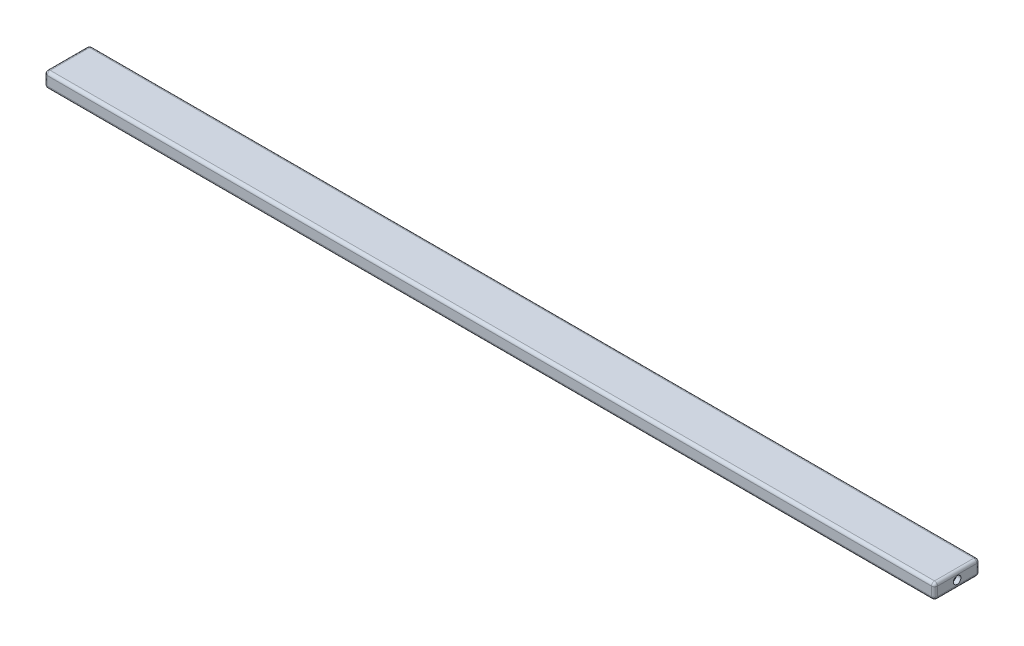
ISO-10303-21;
HEADER;
FILE_DESCRIPTION(('STEP AP214'),'2;1');
FILE_NAME('part.step','',(''),(''),'','','');
FILE_SCHEMA(('AUTOMOTIVE_DESIGN { 1 0 10303 214 1 1 1 1 }'));
ENDSEC;
DATA;
#1=APPLICATION_CONTEXT('core data for automotive mechanical design processes');
#2=APPLICATION_PROTOCOL_DEFINITION('international standard','automotive_design',2000,#1);
#3=PRODUCT_CONTEXT('',#1,'mechanical');
#4=PRODUCT('Part','Part','',(#3));
#5=PRODUCT_RELATED_PRODUCT_CATEGORY('part','',(#4));
#6=PRODUCT_DEFINITION_FORMATION('','',#4);
#7=PRODUCT_DEFINITION_CONTEXT('part definition',#1,'design');
#8=PRODUCT_DEFINITION('design','',#6,#7);
#9=PRODUCT_DEFINITION_SHAPE('','',#8);
#10=(LENGTH_UNIT() NAMED_UNIT(*) SI_UNIT(.MILLI.,.METRE.));
#11=(NAMED_UNIT(*) PLANE_ANGLE_UNIT() SI_UNIT($,.RADIAN.));
#12=(NAMED_UNIT(*) SI_UNIT($,.STERADIAN.) SOLID_ANGLE_UNIT());
#13=UNCERTAINTY_MEASURE_WITH_UNIT(LENGTH_MEASURE(1.E-05),#10,'distance_accuracy_value','');
#14=(GEOMETRIC_REPRESENTATION_CONTEXT(3) GLOBAL_UNCERTAINTY_ASSIGNED_CONTEXT((#13)) GLOBAL_UNIT_ASSIGNED_CONTEXT((#10,
#11,#12)) REPRESENTATION_CONTEXT('',''));
#15=CARTESIAN_POINT('',(0.,0.,0.));
#16=DIRECTION('',(0.,0.,1.));
#17=DIRECTION('',(1.,0.,0.));
#18=AXIS2_PLACEMENT_3D('',#15,#16,#17);
#19=CARTESIAN_POINT('',(-295.,10.,30.));
#20=DIRECTION('',(1.,0.,0.));
#21=DIRECTION('',(0.,0.,-1.));
#22=AXIS2_PLACEMENT_3D('',#19,#20,#21);
#23=PLANE('',#22);
#24=CARTESIAN_POINT('',(-295.,5.,10.));
#25=DIRECTION('',(-1.,0.,0.));
#26=DIRECTION('',(0.,0.,1.));
#27=AXIS2_PLACEMENT_3D('',#24,#25,#26);
#28=CIRCLE('',#27,2.5);
#29=CARTESIAN_POINT('',(-295.,5.,12.5));
#30=VERTEX_POINT('',#29);
#31=EDGE_CURVE('E194',#30,#30,#28,.T.);
#32=ORIENTED_EDGE('',*,*,#31,.F.);
#33=EDGE_LOOP('',(#32));
#34=FACE_BOUND('',#33,.T.);
#35=DIRECTION('',(0.,0.,-1.));
#36=VECTOR('',#35,1.);
#37=CARTESIAN_POINT('',(-295.,2.,30.));
#38=LINE('',#37,#36);
#39=CARTESIAN_POINT('',(-295.,2.,2.));
#40=VERTEX_POINT('',#39);
#41=CARTESIAN_POINT('',(-295.,2.,28.));
#42=VERTEX_POINT('',#41);
#43=EDGE_CURVE('E217',#40,#42,#38,.F.);
#44=ORIENTED_EDGE('',*,*,#43,.T.);
#45=DIRECTION('',(0.,-1.,0.));
#46=VECTOR('',#45,1.);
#47=CARTESIAN_POINT('',(-295.,10.,28.));
#48=LINE('',#47,#46);
#49=CARTESIAN_POINT('',(-295.,8.,28.));
#50=VERTEX_POINT('',#49);
#51=EDGE_CURVE('E221',#42,#50,#48,.F.);
#52=ORIENTED_EDGE('',*,*,#51,.T.);
#53=DIRECTION('',(0.,0.,-1.));
#54=VECTOR('',#53,1.);
#55=CARTESIAN_POINT('',(-295.,8.,30.));
#56=LINE('',#55,#54);
#57=CARTESIAN_POINT('',(-295.,8.,2.));
#58=VERTEX_POINT('',#57);
#59=EDGE_CURVE('E214',#50,#58,#56,.T.);
#60=ORIENTED_EDGE('',*,*,#59,.T.);
#61=DIRECTION('',(0.,-1.,0.));
#62=VECTOR('',#61,1.);
#63=CARTESIAN_POINT('',(-295.,10.,2.));
#64=LINE('',#63,#62);
#65=EDGE_CURVE('E211',#58,#40,#64,.T.);
#66=ORIENTED_EDGE('',*,*,#65,.T.);
#67=EDGE_LOOP('',(#44,#52,#60,#66));
#68=FACE_BOUND('',#67,.T.);
#69=ADVANCED_FACE('F45',(#34,#68),#23,.F.);
#70=CARTESIAN_POINT('',(-295.,0.,30.));
#71=DIRECTION('',(0.,1.,0.));
#72=DIRECTION('',(0.,0.,1.));
#73=AXIS2_PLACEMENT_3D('',#70,#71,#72);
#74=PLANE('',#73);
#75=DIRECTION('',(1.,0.,0.));
#76=VECTOR('',#75,1.);
#77=CARTESIAN_POINT('',(-295.,0.,28.));
#78=LINE('',#77,#76);
#79=CARTESIAN_POINT('',(293.,0.,28.));
#80=VERTEX_POINT('',#79);
#81=CARTESIAN_POINT('',(-293.,0.,28.));
#82=VERTEX_POINT('',#81);
#83=EDGE_CURVE('E157',#80,#82,#78,.F.);
#84=ORIENTED_EDGE('',*,*,#83,.T.);
#85=DIRECTION('',(0.,0.,-1.));
#86=VECTOR('',#85,1.);
#87=CARTESIAN_POINT('',(-293.,0.,30.));
#88=LINE('',#87,#86);
#89=CARTESIAN_POINT('',(-293.,0.,2.));
#90=VERTEX_POINT('',#89);
#91=EDGE_CURVE('E208',#82,#90,#88,.T.);
#92=ORIENTED_EDGE('',*,*,#91,.T.);
#93=DIRECTION('',(1.,0.,0.));
#94=VECTOR('',#93,1.);
#95=CARTESIAN_POINT('',(-295.,0.,2.));
#96=LINE('',#95,#94);
#97=CARTESIAN_POINT('',(293.,0.,2.));
#98=VERTEX_POINT('',#97);
#99=EDGE_CURVE('E160',#90,#98,#96,.T.);
#100=ORIENTED_EDGE('',*,*,#99,.T.);
#101=DIRECTION('',(0.,0.,-1.));
#102=VECTOR('',#101,1.);
#103=CARTESIAN_POINT('',(293.,0.,30.));
#104=LINE('',#103,#102);
#105=EDGE_CURVE('E143',#98,#80,#104,.F.);
#106=ORIENTED_EDGE('',*,*,#105,.T.);
#107=EDGE_LOOP('',(#84,#92,#100,#106));
#108=FACE_BOUND('',#107,.T.);
#109=ADVANCED_FACE('F155',(#108),#74,.F.);
#110=CARTESIAN_POINT('',(295.,0.,30.));
#111=DIRECTION('',(-1.,0.,0.));
#112=DIRECTION('',(0.,0.,1.));
#113=AXIS2_PLACEMENT_3D('',#110,#111,#112);
#114=PLANE('',#113);
#115=CARTESIAN_POINT('',(295.,5.,15.));
#116=DIRECTION('',(1.,0.,0.));
#117=DIRECTION('',(0.,0.,-1.));
#118=AXIS2_PLACEMENT_3D('',#115,#116,#117);
#119=CIRCLE('',#118,2.5);
#120=CARTESIAN_POINT('',(295.,5.,12.5));
#121=VERTEX_POINT('',#120);
#122=EDGE_CURVE('E203',#121,#121,#119,.T.);
#123=ORIENTED_EDGE('',*,*,#122,.F.);
#124=EDGE_LOOP('',(#123));
#125=FACE_BOUND('',#124,.T.);
#126=DIRECTION('',(0.,0.,-1.));
#127=VECTOR('',#126,1.);
#128=CARTESIAN_POINT('',(295.,8.,30.));
#129=LINE('',#128,#127);
#130=CARTESIAN_POINT('',(295.,8.,2.));
#131=VERTEX_POINT('',#130);
#132=CARTESIAN_POINT('',(295.,8.,28.));
#133=VERTEX_POINT('',#132);
#134=EDGE_CURVE('E261',#131,#133,#129,.F.);
#135=ORIENTED_EDGE('',*,*,#134,.T.);
#136=DIRECTION('',(0.,1.,0.));
#137=VECTOR('',#136,1.);
#138=CARTESIAN_POINT('',(295.,2.,28.));
#139=LINE('',#138,#137);
#140=CARTESIAN_POINT('',(295.,2.,28.));
#141=VERTEX_POINT('',#140);
#142=EDGE_CURVE('E11',#133,#141,#139,.F.);
#143=ORIENTED_EDGE('',*,*,#142,.T.);
#144=DIRECTION('',(0.,0.,-1.));
#145=VECTOR('',#144,1.);
#146=CARTESIAN_POINT('',(295.,2.,30.));
#147=LINE('',#146,#145);
#148=CARTESIAN_POINT('',(295.,2.,2.));
#149=VERTEX_POINT('',#148);
#150=EDGE_CURVE('E145',#141,#149,#147,.T.);
#151=ORIENTED_EDGE('',*,*,#150,.T.);
#152=DIRECTION('',(0.,1.,0.));
#153=VECTOR('',#152,1.);
#154=CARTESIAN_POINT('',(295.,0.,2.));
#155=LINE('',#154,#153);
#156=EDGE_CURVE('E177',#149,#131,#155,.T.);
#157=ORIENTED_EDGE('',*,*,#156,.T.);
#158=EDGE_LOOP('',(#135,#143,#151,#157));
#159=FACE_BOUND('',#158,.T.);
#160=ADVANCED_FACE('F338',(#125,#159),#114,.F.);
#161=CARTESIAN_POINT('',(295.,10.,30.));
#162=DIRECTION('',(0.,-1.,0.));
#163=DIRECTION('',(0.,0.,-1.));
#164=AXIS2_PLACEMENT_3D('',#161,#162,#163);
#165=PLANE('',#164);
#166=DIRECTION('',(-1.,0.,0.));
#167=VECTOR('',#166,1.);
#168=CARTESIAN_POINT('',(295.,10.,2.));
#169=LINE('',#168,#167);
#170=CARTESIAN_POINT('',(293.,10.,2.));
#171=VERTEX_POINT('',#170);
#172=CARTESIAN_POINT('',(-293.,10.,2.));
#173=VERTEX_POINT('',#172);
#174=EDGE_CURVE('E231',#171,#173,#169,.T.);
#175=ORIENTED_EDGE('',*,*,#174,.T.);
#176=DIRECTION('',(0.,0.,-1.));
#177=VECTOR('',#176,1.);
#178=CARTESIAN_POINT('',(-293.,10.,30.));
#179=LINE('',#178,#177);
#180=CARTESIAN_POINT('',(-293.,10.,28.));
#181=VERTEX_POINT('',#180);
#182=EDGE_CURVE('E234',#173,#181,#179,.F.);
#183=ORIENTED_EDGE('',*,*,#182,.T.);
#184=DIRECTION('',(-1.,0.,0.));
#185=VECTOR('',#184,1.);
#186=CARTESIAN_POINT('',(295.,10.,28.));
#187=LINE('',#186,#185);
#188=CARTESIAN_POINT('',(293.,10.,28.));
#189=VERTEX_POINT('',#188);
#190=EDGE_CURVE('E224',#181,#189,#187,.F.);
#191=ORIENTED_EDGE('',*,*,#190,.T.);
#192=DIRECTION('',(0.,0.,-1.));
#193=VECTOR('',#192,1.);
#194=CARTESIAN_POINT('',(293.,10.,30.));
#195=LINE('',#194,#193);
#196=EDGE_CURVE('E228',#189,#171,#195,.T.);
#197=ORIENTED_EDGE('',*,*,#196,.T.);
#198=EDGE_LOOP('',(#175,#183,#191,#197));
#199=FACE_BOUND('',#198,.T.);
#200=ADVANCED_FACE('F430',(#199),#165,.F.);
#201=CARTESIAN_POINT('',(0.,0.,30.));
#202=DIRECTION('',(0.,0.,1.));
#203=DIRECTION('',(1.,0.,0.));
#204=AXIS2_PLACEMENT_3D('',#201,#202,#203);
#205=PLANE('',#204);
#206=DIRECTION('',(1.,0.,0.));
#207=VECTOR('',#206,1.);
#208=CARTESIAN_POINT('',(295.,2.,30.));
#209=LINE('',#208,#207);
#210=CARTESIAN_POINT('',(-293.,2.,30.));
#211=VERTEX_POINT('',#210);
#212=CARTESIAN_POINT('',(293.,2.,30.));
#213=VERTEX_POINT('',#212);
#214=EDGE_CURVE('E245',#211,#213,#209,.T.);
#215=ORIENTED_EDGE('',*,*,#214,.T.);
#216=DIRECTION('',(0.,1.,0.));
#217=VECTOR('',#216,1.);
#218=CARTESIAN_POINT('',(293.,8.,30.));
#219=LINE('',#218,#217);
#220=CARTESIAN_POINT('',(293.,8.,30.));
#221=VERTEX_POINT('',#220);
#222=EDGE_CURVE('E55',#213,#221,#219,.T.);
#223=ORIENTED_EDGE('',*,*,#222,.T.);
#224=DIRECTION('',(-1.,0.,0.));
#225=VECTOR('',#224,1.);
#226=CARTESIAN_POINT('',(-295.,8.,30.));
#227=LINE('',#226,#225);
#228=CARTESIAN_POINT('',(-293.,8.,30.));
#229=VERTEX_POINT('',#228);
#230=EDGE_CURVE('E238',#221,#229,#227,.T.);
#231=ORIENTED_EDGE('',*,*,#230,.T.);
#232=DIRECTION('',(0.,-1.,0.));
#233=VECTOR('',#232,1.);
#234=CARTESIAN_POINT('',(-293.,0.,30.));
#235=LINE('',#234,#233);
#236=EDGE_CURVE('E241',#229,#211,#235,.T.);
#237=ORIENTED_EDGE('',*,*,#236,.T.);
#238=EDGE_LOOP('',(#215,#223,#231,#237));
#239=FACE_BOUND('',#238,.T.);
#240=ADVANCED_FACE('F424',(#239),#205,.T.);
#241=CARTESIAN_POINT('',(0.,0.,0.));
#242=DIRECTION('',(0.,0.,1.));
#243=DIRECTION('',(1.,0.,0.));
#244=AXIS2_PLACEMENT_3D('',#241,#242,#243);
#245=PLANE('',#244);
#246=DIRECTION('',(1.,0.,0.));
#247=VECTOR('',#246,1.);
#248=CARTESIAN_POINT('',(0.,2.,0.));
#249=LINE('',#248,#247);
#250=CARTESIAN_POINT('',(293.,2.,0.));
#251=VERTEX_POINT('',#250);
#252=CARTESIAN_POINT('',(-293.,2.,0.));
#253=VERTEX_POINT('',#252);
#254=EDGE_CURVE('E254',#251,#253,#249,.F.);
#255=ORIENTED_EDGE('',*,*,#254,.T.);
#256=DIRECTION('',(0.,-1.,0.));
#257=VECTOR('',#256,1.);
#258=CARTESIAN_POINT('',(-293.,0.,0.));
#259=LINE('',#258,#257);
#260=CARTESIAN_POINT('',(-293.,8.,0.));
#261=VERTEX_POINT('',#260);
#262=EDGE_CURVE('E257',#253,#261,#259,.F.);
#263=ORIENTED_EDGE('',*,*,#262,.T.);
#264=DIRECTION('',(-1.,0.,0.));
#265=VECTOR('',#264,1.);
#266=CARTESIAN_POINT('',(0.,8.,0.));
#267=LINE('',#266,#265);
#268=CARTESIAN_POINT('',(293.,8.,0.));
#269=VERTEX_POINT('',#268);
#270=EDGE_CURVE('E251',#261,#269,#267,.F.);
#271=ORIENTED_EDGE('',*,*,#270,.T.);
#272=DIRECTION('',(0.,1.,0.));
#273=VECTOR('',#272,1.);
#274=CARTESIAN_POINT('',(293.,0.,0.));
#275=LINE('',#274,#273);
#276=EDGE_CURVE('E248',#269,#251,#275,.F.);
#277=ORIENTED_EDGE('',*,*,#276,.T.);
#278=EDGE_LOOP('',(#255,#263,#271,#277));
#279=FACE_BOUND('',#278,.T.);
#280=ADVANCED_FACE('F420',(#279),#245,.F.);
#281=CARTESIAN_POINT('',(293.,8.,30.));
#282=DIRECTION('',(0.,0.,-1.));
#283=DIRECTION('',(-1.,0.,0.));
#284=AXIS2_PLACEMENT_3D('',#281,#282,#283);
#285=CYLINDRICAL_SURFACE('',#284,2.);
#286=ORIENTED_EDGE('',*,*,#196,.F.);
#287=CARTESIAN_POINT('',(293.,8.,28.));
#288=DIRECTION('',(0.,0.,-1.));
#289=DIRECTION('',(-1.,0.,0.));
#290=AXIS2_PLACEMENT_3D('',#287,#288,#289);
#291=CIRCLE('',#290,2.);
#292=EDGE_CURVE('E63',#189,#133,#291,.T.);
#293=ORIENTED_EDGE('',*,*,#292,.T.);
#294=ORIENTED_EDGE('',*,*,#134,.F.);
#295=CARTESIAN_POINT('',(293.,8.,2.));
#296=DIRECTION('',(0.,0.,-1.));
#297=DIRECTION('',(-1.,0.,0.));
#298=AXIS2_PLACEMENT_3D('',#295,#296,#297);
#299=CIRCLE('',#298,2.);
#300=EDGE_CURVE('E170',#171,#131,#299,.T.);
#301=ORIENTED_EDGE('',*,*,#300,.F.);
#302=EDGE_LOOP('',(#286,#293,#294,#301));
#303=FACE_BOUND('',#302,.T.);
#304=ADVANCED_FACE('F335',(#303),#285,.T.);
#305=CARTESIAN_POINT('',(293.,8.,2.));
#306=DIRECTION('',(1.,0.,0.));
#307=DIRECTION('',(0.,0.,-1.));
#308=AXIS2_PLACEMENT_3D('',#305,#306,#307);
#309=SPHERICAL_SURFACE('',#308,2.);
#310=CARTESIAN_POINT('',(293.,8.,2.));
#311=DIRECTION('',(1.,0.,0.));
#312=DIRECTION('',(0.,0.,-1.));
#313=AXIS2_PLACEMENT_3D('',#310,#311,#312);
#314=CIRCLE('',#313,2.);
#315=EDGE_CURVE('E318',#171,#269,#314,.F.);
#316=ORIENTED_EDGE('',*,*,#315,.F.);
#317=ORIENTED_EDGE('',*,*,#300,.T.);
#318=CARTESIAN_POINT('',(293.,8.,2.));
#319=DIRECTION('',(0.,1.,0.));
#320=DIRECTION('',(0.,0.,1.));
#321=AXIS2_PLACEMENT_3D('',#318,#319,#320);
#322=CIRCLE('',#321,2.);
#323=EDGE_CURVE('E321',#269,#131,#322,.F.);
#324=ORIENTED_EDGE('',*,*,#323,.F.);
#325=EDGE_LOOP('',(#316,#317,#324));
#326=FACE_BOUND('',#325,.T.);
#327=ADVANCED_FACE('F333',(#326),#309,.T.);
#328=CARTESIAN_POINT('',(0.,8.,28.));
#329=DIRECTION('',(1.,0.,0.));
#330=DIRECTION('',(0.,0.,-1.));
#331=AXIS2_PLACEMENT_3D('',#328,#329,#330);
#332=CYLINDRICAL_SURFACE('',#331,2.);
#333=ORIENTED_EDGE('',*,*,#230,.F.);
#334=CARTESIAN_POINT('',(293.,8.,28.));
#335=DIRECTION('',(1.,0.,0.));
#336=DIRECTION('',(0.,0.,-1.));
#337=AXIS2_PLACEMENT_3D('',#334,#335,#336);
#338=CIRCLE('',#337,2.);
#339=EDGE_CURVE('E150',#221,#189,#338,.F.);
#340=ORIENTED_EDGE('',*,*,#339,.T.);
#341=ORIENTED_EDGE('',*,*,#190,.F.);
#342=CARTESIAN_POINT('',(-293.,8.,28.));
#343=DIRECTION('',(-1.,0.,0.));
#344=DIRECTION('',(0.,0.,1.));
#345=AXIS2_PLACEMENT_3D('',#342,#343,#344);
#346=CIRCLE('',#345,2.);
#347=EDGE_CURVE('E311',#229,#181,#346,.T.);
#348=ORIENTED_EDGE('',*,*,#347,.F.);
#349=EDGE_LOOP('',(#333,#340,#341,#348));
#350=FACE_BOUND('',#349,.T.);
#351=ADVANCED_FACE('F413',(#350),#332,.T.);
#352=CARTESIAN_POINT('',(293.,0.,2.));
#353=DIRECTION('',(0.,1.,0.));
#354=DIRECTION('',(0.,0.,1.));
#355=AXIS2_PLACEMENT_3D('',#352,#353,#354);
#356=CYLINDRICAL_SURFACE('',#355,2.);
#357=ORIENTED_EDGE('',*,*,#323,.T.);
#358=ORIENTED_EDGE('',*,*,#156,.F.);
#359=CARTESIAN_POINT('',(293.,2.,2.));
#360=DIRECTION('',(0.,-1.,0.));
#361=DIRECTION('',(0.,0.,-1.));
#362=AXIS2_PLACEMENT_3D('',#359,#360,#361);
#363=CIRCLE('',#362,2.);
#364=EDGE_CURVE('E304',#251,#149,#363,.T.);
#365=ORIENTED_EDGE('',*,*,#364,.F.);
#366=ORIENTED_EDGE('',*,*,#276,.F.);
#367=EDGE_LOOP('',(#357,#358,#365,#366));
#368=FACE_BOUND('',#367,.T.);
#369=ADVANCED_FACE('F409',(#368),#356,.T.);
#370=CARTESIAN_POINT('',(295.,8.,2.));
#371=DIRECTION('',(-1.,0.,0.));
#372=DIRECTION('',(0.,0.,1.));
#373=AXIS2_PLACEMENT_3D('',#370,#371,#372);
#374=CYLINDRICAL_SURFACE('',#373,2.);
#375=ORIENTED_EDGE('',*,*,#315,.T.);
#376=ORIENTED_EDGE('',*,*,#270,.F.);
#377=CARTESIAN_POINT('',(-293.,8.,2.));
#378=DIRECTION('',(-1.,0.,0.));
#379=DIRECTION('',(0.,0.,1.));
#380=AXIS2_PLACEMENT_3D('',#377,#378,#379);
#381=CIRCLE('',#380,2.);
#382=EDGE_CURVE('E300',#173,#261,#381,.T.);
#383=ORIENTED_EDGE('',*,*,#382,.F.);
#384=ORIENTED_EDGE('',*,*,#174,.F.);
#385=EDGE_LOOP('',(#375,#376,#383,#384));
#386=FACE_BOUND('',#385,.T.);
#387=ADVANCED_FACE('F405',(#386),#374,.T.);
#388=CARTESIAN_POINT('',(-293.,8.,30.));
#389=DIRECTION('',(0.,0.,-1.));
#390=DIRECTION('',(-1.,0.,0.));
#391=AXIS2_PLACEMENT_3D('',#388,#389,#390);
#392=CYLINDRICAL_SURFACE('',#391,2.);
#393=CARTESIAN_POINT('',(-293.,8.,28.));
#394=DIRECTION('',(0.,0.,1.));
#395=DIRECTION('',(1.,0.,0.));
#396=AXIS2_PLACEMENT_3D('',#393,#394,#395);
#397=CIRCLE('',#396,2.);
#398=EDGE_CURVE('E314',#181,#50,#397,.T.);
#399=ORIENTED_EDGE('',*,*,#398,.F.);
#400=ORIENTED_EDGE('',*,*,#182,.F.);
#401=CARTESIAN_POINT('',(-293.,8.,2.));
#402=DIRECTION('',(0.,0.,-1.));
#403=DIRECTION('',(-1.,0.,0.));
#404=AXIS2_PLACEMENT_3D('',#401,#402,#403);
#405=CIRCLE('',#404,2.);
#406=EDGE_CURVE('E296',#58,#173,#405,.T.);
#407=ORIENTED_EDGE('',*,*,#406,.F.);
#408=ORIENTED_EDGE('',*,*,#59,.F.);
#409=EDGE_LOOP('',(#399,#400,#407,#408));
#410=FACE_BOUND('',#409,.T.);
#411=ADVANCED_FACE('F401',(#410),#392,.T.);
#412=CARTESIAN_POINT('',(-293.,8.,28.));
#413=DIRECTION('',(0.,1.,0.));
#414=DIRECTION('',(0.,0.,1.));
#415=AXIS2_PLACEMENT_3D('',#412,#413,#414);
#416=SPHERICAL_SURFACE('',#415,2.);
#417=ORIENTED_EDGE('',*,*,#347,.T.);
#418=ORIENTED_EDGE('',*,*,#398,.T.);
#419=CARTESIAN_POINT('',(-293.,8.,28.));
#420=DIRECTION('',(0.,1.,0.));
#421=DIRECTION('',(0.,0.,1.));
#422=AXIS2_PLACEMENT_3D('',#419,#420,#421);
#423=CIRCLE('',#422,2.);
#424=EDGE_CURVE('E292',#229,#50,#423,.F.);
#425=ORIENTED_EDGE('',*,*,#424,.F.);
#426=EDGE_LOOP('',(#417,#418,#425));
#427=FACE_BOUND('',#426,.T.);
#428=ADVANCED_FACE('F398',(#427),#416,.T.);
#429=CARTESIAN_POINT('',(293.,2.,30.));
#430=DIRECTION('',(0.,0.,-1.));
#431=DIRECTION('',(-1.,0.,0.));
#432=AXIS2_PLACEMENT_3D('',#429,#430,#431);
#433=CYLINDRICAL_SURFACE('',#432,2.);
#434=ORIENTED_EDGE('',*,*,#150,.F.);
#435=CARTESIAN_POINT('',(293.,2.,28.));
#436=DIRECTION('',(0.,0.,-1.));
#437=DIRECTION('',(-1.,0.,0.));
#438=AXIS2_PLACEMENT_3D('',#435,#436,#437);
#439=CIRCLE('',#438,2.);
#440=EDGE_CURVE('E139',#141,#80,#439,.T.);
#441=ORIENTED_EDGE('',*,*,#440,.T.);
#442=ORIENTED_EDGE('',*,*,#105,.F.);
#443=CARTESIAN_POINT('',(293.,2.,2.));
#444=DIRECTION('',(0.,0.,-1.));
#445=DIRECTION('',(-1.,0.,0.));
#446=AXIS2_PLACEMENT_3D('',#443,#444,#445);
#447=CIRCLE('',#446,2.);
#448=EDGE_CURVE('E308',#149,#98,#447,.T.);
#449=ORIENTED_EDGE('',*,*,#448,.F.);
#450=EDGE_LOOP('',(#434,#441,#442,#449));
#451=FACE_BOUND('',#450,.T.);
#452=ADVANCED_FACE('F141',(#451),#433,.T.);
#453=CARTESIAN_POINT('',(293.,2.,2.));
#454=DIRECTION('',(1.,0.,0.));
#455=DIRECTION('',(0.,0.,-1.));
#456=AXIS2_PLACEMENT_3D('',#453,#454,#455);
#457=SPHERICAL_SURFACE('',#456,2.);
#458=ORIENTED_EDGE('',*,*,#364,.T.);
#459=ORIENTED_EDGE('',*,*,#448,.T.);
#460=CARTESIAN_POINT('',(293.,2.,2.));
#461=DIRECTION('',(1.,0.,0.));
#462=DIRECTION('',(0.,0.,-1.));
#463=AXIS2_PLACEMENT_3D('',#460,#461,#462);
#464=CIRCLE('',#463,2.);
#465=EDGE_CURVE('E288',#251,#98,#464,.F.);
#466=ORIENTED_EDGE('',*,*,#465,.F.);
#467=EDGE_LOOP('',(#458,#459,#466));
#468=FACE_BOUND('',#467,.T.);
#469=ADVANCED_FACE('F391',(#468),#457,.T.);
#470=CARTESIAN_POINT('',(-293.,8.,2.));
#471=DIRECTION('',(0.,1.,0.));
#472=DIRECTION('',(0.,0.,1.));
#473=AXIS2_PLACEMENT_3D('',#470,#471,#472);
#474=SPHERICAL_SURFACE('',#473,2.);
#475=ORIENTED_EDGE('',*,*,#406,.T.);
#476=ORIENTED_EDGE('',*,*,#382,.T.);
#477=CARTESIAN_POINT('',(-293.,8.,2.));
#478=DIRECTION('',(0.,1.,0.));
#479=DIRECTION('',(0.,0.,1.));
#480=AXIS2_PLACEMENT_3D('',#477,#478,#479);
#481=CIRCLE('',#480,2.);
#482=EDGE_CURVE('E285',#58,#261,#481,.F.);
#483=ORIENTED_EDGE('',*,*,#482,.F.);
#484=EDGE_LOOP('',(#475,#476,#483));
#485=FACE_BOUND('',#484,.T.);
#486=ADVANCED_FACE('F387',(#485),#474,.T.);
#487=CARTESIAN_POINT('',(-293.,0.,28.));
#488=DIRECTION('',(0.,1.,0.));
#489=DIRECTION('',(0.,0.,1.));
#490=AXIS2_PLACEMENT_3D('',#487,#488,#489);
#491=CYLINDRICAL_SURFACE('',#490,2.);
#492=ORIENTED_EDGE('',*,*,#424,.T.);
#493=ORIENTED_EDGE('',*,*,#51,.F.);
#494=CARTESIAN_POINT('',(-293.,2.,28.));
#495=DIRECTION('',(0.,-1.,0.));
#496=DIRECTION('',(0.,0.,-1.));
#497=AXIS2_PLACEMENT_3D('',#494,#495,#496);
#498=CIRCLE('',#497,2.);
#499=EDGE_CURVE('E281',#211,#42,#498,.T.);
#500=ORIENTED_EDGE('',*,*,#499,.F.);
#501=ORIENTED_EDGE('',*,*,#236,.F.);
#502=EDGE_LOOP('',(#492,#493,#500,#501));
#503=FACE_BOUND('',#502,.T.);
#504=ADVANCED_FACE('F384',(#503),#491,.T.);
#505=CARTESIAN_POINT('',(0.,2.,28.));
#506=DIRECTION('',(-1.,0.,0.));
#507=DIRECTION('',(0.,0.,1.));
#508=AXIS2_PLACEMENT_3D('',#505,#506,#507);
#509=CYLINDRICAL_SURFACE('',#508,2.);
#510=ORIENTED_EDGE('',*,*,#83,.F.);
#511=CARTESIAN_POINT('',(293.,2.,28.));
#512=DIRECTION('',(-1.,0.,0.));
#513=DIRECTION('',(0.,0.,1.));
#514=AXIS2_PLACEMENT_3D('',#511,#512,#513);
#515=CIRCLE('',#514,2.);
#516=EDGE_CURVE('E151',#80,#213,#515,.T.);
#517=ORIENTED_EDGE('',*,*,#516,.T.);
#518=ORIENTED_EDGE('',*,*,#214,.F.);
#519=CARTESIAN_POINT('',(-293.,2.,28.));
#520=DIRECTION('',(-1.,0.,0.));
#521=DIRECTION('',(0.,0.,1.));
#522=AXIS2_PLACEMENT_3D('',#519,#520,#521);
#523=CIRCLE('',#522,2.);
#524=EDGE_CURVE('E167',#82,#211,#523,.T.);
#525=ORIENTED_EDGE('',*,*,#524,.F.);
#526=EDGE_LOOP('',(#510,#517,#518,#525));
#527=FACE_BOUND('',#526,.T.);
#528=ADVANCED_FACE('F165',(#527),#509,.T.);
#529=CARTESIAN_POINT('',(-295.,2.,2.));
#530=DIRECTION('',(1.,0.,0.));
#531=DIRECTION('',(0.,0.,-1.));
#532=AXIS2_PLACEMENT_3D('',#529,#530,#531);
#533=CYLINDRICAL_SURFACE('',#532,2.);
#534=ORIENTED_EDGE('',*,*,#465,.T.);
#535=ORIENTED_EDGE('',*,*,#99,.F.);
#536=CARTESIAN_POINT('',(-293.,2.,2.));
#537=DIRECTION('',(-1.,0.,0.));
#538=DIRECTION('',(0.,0.,1.));
#539=AXIS2_PLACEMENT_3D('',#536,#537,#538);
#540=CIRCLE('',#539,2.);
#541=EDGE_CURVE('E275',#253,#90,#540,.T.);
#542=ORIENTED_EDGE('',*,*,#541,.F.);
#543=ORIENTED_EDGE('',*,*,#254,.F.);
#544=EDGE_LOOP('',(#534,#535,#542,#543));
#545=FACE_BOUND('',#544,.T.);
#546=ADVANCED_FACE('F377',(#545),#533,.T.);
#547=CARTESIAN_POINT('',(-293.,10.,2.));
#548=DIRECTION('',(0.,-1.,0.));
#549=DIRECTION('',(0.,0.,-1.));
#550=AXIS2_PLACEMENT_3D('',#547,#548,#549);
#551=CYLINDRICAL_SURFACE('',#550,2.);
#552=ORIENTED_EDGE('',*,*,#482,.T.);
#553=ORIENTED_EDGE('',*,*,#262,.F.);
#554=CARTESIAN_POINT('',(-293.,2.,2.));
#555=DIRECTION('',(0.,-1.,0.));
#556=DIRECTION('',(0.,0.,-1.));
#557=AXIS2_PLACEMENT_3D('',#554,#555,#556);
#558=CIRCLE('',#557,2.);
#559=EDGE_CURVE('E271',#40,#253,#558,.T.);
#560=ORIENTED_EDGE('',*,*,#559,.F.);
#561=ORIENTED_EDGE('',*,*,#65,.F.);
#562=EDGE_LOOP('',(#552,#553,#560,#561));
#563=FACE_BOUND('',#562,.T.);
#564=ADVANCED_FACE('F373',(#563),#551,.T.);
#565=CARTESIAN_POINT('',(-293.,2.,28.));
#566=DIRECTION('',(0.,0.,1.));
#567=DIRECTION('',(1.,0.,0.));
#568=AXIS2_PLACEMENT_3D('',#565,#566,#567);
#569=SPHERICAL_SURFACE('',#568,2.);
#570=ORIENTED_EDGE('',*,*,#524,.T.);
#571=ORIENTED_EDGE('',*,*,#499,.T.);
#572=CARTESIAN_POINT('',(-293.,2.,28.));
#573=DIRECTION('',(0.,0.,1.));
#574=DIRECTION('',(1.,0.,0.));
#575=AXIS2_PLACEMENT_3D('',#572,#573,#574);
#576=CIRCLE('',#575,2.);
#577=EDGE_CURVE('E268',#82,#42,#576,.F.);
#578=ORIENTED_EDGE('',*,*,#577,.F.);
#579=EDGE_LOOP('',(#570,#571,#578));
#580=FACE_BOUND('',#579,.T.);
#581=ADVANCED_FACE('F369',(#580),#569,.T.);
#582=CARTESIAN_POINT('',(-293.,2.,2.));
#583=DIRECTION('',(0.,0.,-1.));
#584=DIRECTION('',(-1.,0.,0.));
#585=AXIS2_PLACEMENT_3D('',#582,#583,#584);
#586=SPHERICAL_SURFACE('',#585,2.);
#587=ORIENTED_EDGE('',*,*,#559,.T.);
#588=ORIENTED_EDGE('',*,*,#541,.T.);
#589=CARTESIAN_POINT('',(-293.,2.,2.));
#590=DIRECTION('',(0.,0.,-1.));
#591=DIRECTION('',(-1.,0.,0.));
#592=AXIS2_PLACEMENT_3D('',#589,#590,#591);
#593=CIRCLE('',#592,2.);
#594=EDGE_CURVE('E192',#40,#90,#593,.F.);
#595=ORIENTED_EDGE('',*,*,#594,.F.);
#596=EDGE_LOOP('',(#587,#588,#595));
#597=FACE_BOUND('',#596,.T.);
#598=ADVANCED_FACE('F365',(#597),#586,.T.);
#599=CARTESIAN_POINT('',(-293.,2.,30.));
#600=DIRECTION('',(0.,0.,-1.));
#601=DIRECTION('',(-1.,0.,0.));
#602=AXIS2_PLACEMENT_3D('',#599,#600,#601);
#603=CYLINDRICAL_SURFACE('',#602,2.);
#604=ORIENTED_EDGE('',*,*,#577,.T.);
#605=ORIENTED_EDGE('',*,*,#43,.F.);
#606=ORIENTED_EDGE('',*,*,#594,.T.);
#607=ORIENTED_EDGE('',*,*,#91,.F.);
#608=EDGE_LOOP('',(#604,#605,#606,#607));
#609=FACE_BOUND('',#608,.T.);
#610=ADVANCED_FACE('F351',(#609),#603,.T.);
#611=CARTESIAN_POINT('',(293.,8.,28.));
#612=DIRECTION('',(0.,0.,1.));
#613=DIRECTION('',(1.,0.,0.));
#614=AXIS2_PLACEMENT_3D('',#611,#612,#613);
#615=SPHERICAL_SURFACE('',#614,2.);
#616=ORIENTED_EDGE('',*,*,#292,.F.);
#617=ORIENTED_EDGE('',*,*,#339,.F.);
#618=CARTESIAN_POINT('',(293.,8.,28.));
#619=DIRECTION('',(0.,-1.,0.));
#620=DIRECTION('',(0.,0.,-1.));
#621=AXIS2_PLACEMENT_3D('',#618,#619,#620);
#622=CIRCLE('',#621,2.);
#623=EDGE_CURVE('E49',#133,#221,#622,.T.);
#624=ORIENTED_EDGE('',*,*,#623,.F.);
#625=EDGE_LOOP('',(#616,#617,#624));
#626=FACE_BOUND('',#625,.T.);
#627=ADVANCED_FACE('F47',(#626),#615,.T.);
#628=CARTESIAN_POINT('',(293.,0.,28.));
#629=DIRECTION('',(0.,-1.,0.));
#630=DIRECTION('',(0.,0.,-1.));
#631=AXIS2_PLACEMENT_3D('',#628,#629,#630);
#632=CYLINDRICAL_SURFACE('',#631,2.);
#633=ORIENTED_EDGE('',*,*,#623,.T.);
#634=ORIENTED_EDGE('',*,*,#222,.F.);
#635=CARTESIAN_POINT('',(293.,2.,28.));
#636=DIRECTION('',(0.,-1.,0.));
#637=DIRECTION('',(0.,0.,-1.));
#638=AXIS2_PLACEMENT_3D('',#635,#636,#637);
#639=CIRCLE('',#638,2.);
#640=EDGE_CURVE('E173',#141,#213,#639,.T.);
#641=ORIENTED_EDGE('',*,*,#640,.F.);
#642=ORIENTED_EDGE('',*,*,#142,.F.);
#643=EDGE_LOOP('',(#633,#634,#641,#642));
#644=FACE_BOUND('',#643,.T.);
#645=ADVANCED_FACE('F343',(#644),#632,.T.);
#646=CARTESIAN_POINT('',(293.,2.,28.));
#647=DIRECTION('',(0.,0.,1.));
#648=DIRECTION('',(1.,0.,0.));
#649=AXIS2_PLACEMENT_3D('',#646,#647,#648);
#650=SPHERICAL_SURFACE('',#649,2.);
#651=ORIENTED_EDGE('',*,*,#516,.F.);
#652=ORIENTED_EDGE('',*,*,#440,.F.);
#653=ORIENTED_EDGE('',*,*,#640,.T.);
#654=EDGE_LOOP('',(#651,#652,#653));
#655=FACE_BOUND('',#654,.T.);
#656=ADVANCED_FACE('F172',(#655),#650,.T.);
#657=CARTESIAN_POINT('',(-292.,5.,10.));
#658=DIRECTION('',(-1.,0.,0.));
#659=DIRECTION('',(0.,0.,1.));
#660=AXIS2_PLACEMENT_3D('',#657,#658,#659);
#661=CYLINDRICAL_SURFACE('',#660,2.5);
#662=CARTESIAN_POINT('',(-292.,5.,10.));
#663=DIRECTION('',(-1.,0.,0.));
#664=DIRECTION('',(0.,0.,1.));
#665=AXIS2_PLACEMENT_3D('',#662,#663,#664);
#666=CIRCLE('',#665,2.5);
#667=CARTESIAN_POINT('',(-292.,5.,12.5));
#668=VERTEX_POINT('',#667);
#669=EDGE_CURVE('E188',#668,#668,#666,.T.);
#670=ORIENTED_EDGE('',*,*,#669,.F.);
#671=EDGE_LOOP('',(#670));
#672=FACE_BOUND('',#671,.T.);
#673=ORIENTED_EDGE('',*,*,#31,.T.);
#674=EDGE_LOOP('',(#673));
#675=FACE_BOUND('',#674,.T.);
#676=ADVANCED_FACE('F349',(#672,#675),#661,.F.);
#677=CARTESIAN_POINT('',(-292.,5.,10.));
#678=DIRECTION('',(-1.,0.,0.));
#679=DIRECTION('',(0.,0.,1.));
#680=AXIS2_PLACEMENT_3D('',#677,#678,#679);
#681=PLANE('',#680);
#682=ORIENTED_EDGE('',*,*,#669,.T.);
#683=EDGE_LOOP('',(#682));
#684=FACE_BOUND('',#683,.T.);
#685=ADVANCED_FACE('F452',(#684),#681,.T.);
#686=CARTESIAN_POINT('',(292.,5.,15.));
#687=DIRECTION('',(1.,0.,0.));
#688=DIRECTION('',(0.,0.,-1.));
#689=AXIS2_PLACEMENT_3D('',#686,#687,#688);
#690=CYLINDRICAL_SURFACE('',#689,2.5);
#691=CARTESIAN_POINT('',(292.,5.,15.));
#692=DIRECTION('',(1.,0.,0.));
#693=DIRECTION('',(0.,0.,-1.));
#694=AXIS2_PLACEMENT_3D('',#691,#692,#693);
#695=CIRCLE('',#694,2.5);
#696=CARTESIAN_POINT('',(292.,5.,12.5));
#697=VERTEX_POINT('',#696);
#698=EDGE_CURVE('E200',#697,#697,#695,.T.);
#699=ORIENTED_EDGE('',*,*,#698,.F.);
#700=EDGE_LOOP('',(#699));
#701=FACE_BOUND('',#700,.T.);
#702=ORIENTED_EDGE('',*,*,#122,.T.);
#703=EDGE_LOOP('',(#702));
#704=FACE_BOUND('',#703,.T.);
#705=ADVANCED_FACE('F450',(#701,#704),#690,.F.);
#706=CARTESIAN_POINT('',(292.,5.,15.));
#707=DIRECTION('',(1.,0.,0.));
#708=DIRECTION('',(0.,0.,-1.));
#709=AXIS2_PLACEMENT_3D('',#706,#707,#708);
#710=PLANE('',#709);
#711=ORIENTED_EDGE('',*,*,#698,.T.);
#712=EDGE_LOOP('',(#711));
#713=FACE_BOUND('',#712,.T.);
#714=ADVANCED_FACE('F448',(#713),#710,.T.);
#715=CLOSED_SHELL('',(#69,#109,#160,#200,#240,#280,#304,#327,#351,#369,#387,#411,#428,#452,#469,
#486,#504,#528,#546,#564,#581,#598,#610,#627,#645,#656,#676,#685,#705,#714));
#716=MANIFOLD_SOLID_BREP('B2',#715);
#717=ADVANCED_BREP_SHAPE_REPRESENTATION('',(#18,#716),#14);
#718=SHAPE_DEFINITION_REPRESENTATION(#9,#717);
ENDSEC;
END-ISO-10303-21;
